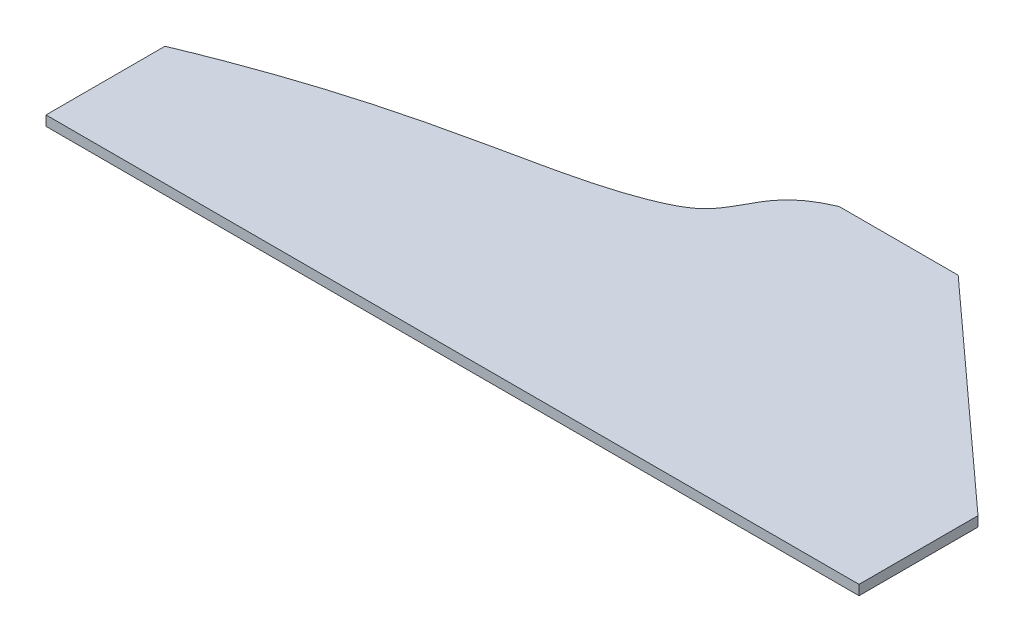
ISO-10303-21;
HEADER;
FILE_DESCRIPTION(('STEP AP214'),'2;1');
FILE_NAME('part.step','',(''),(''),'','','');
FILE_SCHEMA(('AUTOMOTIVE_DESIGN { 1 0 10303 214 1 1 1 1 }'));
ENDSEC;
DATA;
#1=APPLICATION_CONTEXT('core data for automotive mechanical design processes');
#2=APPLICATION_PROTOCOL_DEFINITION('international standard','automotive_design',2000,#1);
#3=PRODUCT_CONTEXT('',#1,'mechanical');
#4=PRODUCT('Part','Part','',(#3));
#5=PRODUCT_RELATED_PRODUCT_CATEGORY('part','',(#4));
#6=PRODUCT_DEFINITION_FORMATION('','',#4);
#7=PRODUCT_DEFINITION_CONTEXT('part definition',#1,'design');
#8=PRODUCT_DEFINITION('design','',#6,#7);
#9=PRODUCT_DEFINITION_SHAPE('','',#8);
#10=(LENGTH_UNIT() NAMED_UNIT(*) SI_UNIT(.MILLI.,.METRE.));
#11=(NAMED_UNIT(*) PLANE_ANGLE_UNIT() SI_UNIT($,.RADIAN.));
#12=(NAMED_UNIT(*) SI_UNIT($,.STERADIAN.) SOLID_ANGLE_UNIT());
#13=UNCERTAINTY_MEASURE_WITH_UNIT(LENGTH_MEASURE(1.E-05),#10,'distance_accuracy_value','');
#14=(GEOMETRIC_REPRESENTATION_CONTEXT(3) GLOBAL_UNCERTAINTY_ASSIGNED_CONTEXT((#13)) GLOBAL_UNIT_ASSIGNED_CONTEXT((#10,
#11,#12)) REPRESENTATION_CONTEXT('',''));
#15=CARTESIAN_POINT('',(0.,0.,0.));
#16=DIRECTION('',(0.,0.,1.));
#17=DIRECTION('',(1.,0.,0.));
#18=AXIS2_PLACEMENT_3D('',#15,#16,#17);
#19=CARTESIAN_POINT('',(107.95,3.175,0.));
#20=DIRECTION('',(-1.,0.,0.));
#21=DIRECTION('',(0.,0.,1.));
#22=AXIS2_PLACEMENT_3D('',#19,#20,#21);
#23=PLANE('',#22);
#24=DIRECTION('',(0.,0.,-1.));
#25=VECTOR('',#24,1.);
#26=CARTESIAN_POINT('',(107.95,0.,0.));
#27=LINE('',#26,#25);
#28=CARTESIAN_POINT('',(107.95,0.,0.));
#29=VERTEX_POINT('',#28);
#30=CARTESIAN_POINT('',(107.95,0.,-38.1));
#31=VERTEX_POINT('',#30);
#32=EDGE_CURVE('E118',#29,#31,#27,.T.);
#33=ORIENTED_EDGE('',*,*,#32,.T.);
#34=DIRECTION('',(0.,-1.,0.));
#35=VECTOR('',#34,1.);
#36=CARTESIAN_POINT('',(107.95,3.175,-38.1));
#37=LINE('',#36,#35);
#38=CARTESIAN_POINT('',(107.95,3.175,-38.1));
#39=VERTEX_POINT('',#38);
#40=EDGE_CURVE('E11',#39,#31,#37,.T.);
#41=ORIENTED_EDGE('',*,*,#40,.F.);
#42=DIRECTION('',(0.,0.,-1.));
#43=VECTOR('',#42,1.);
#44=CARTESIAN_POINT('',(107.95,3.175,0.));
#45=LINE('',#44,#43);
#46=CARTESIAN_POINT('',(107.95,3.175,0.));
#47=VERTEX_POINT('',#46);
#48=EDGE_CURVE('E133',#47,#39,#45,.T.);
#49=ORIENTED_EDGE('',*,*,#48,.F.);
#50=DIRECTION('',(0.,-1.,0.));
#51=VECTOR('',#50,1.);
#52=CARTESIAN_POINT('',(107.95,3.175,0.));
#53=LINE('',#52,#51);
#54=EDGE_CURVE('E111',#47,#29,#53,.T.);
#55=ORIENTED_EDGE('',*,*,#54,.T.);
#56=EDGE_LOOP('',(#33,#41,#49,#55));
#57=FACE_BOUND('',#56,.T.);
#58=ADVANCED_FACE('F31',(#57),#23,.F.);
#59=CARTESIAN_POINT('',(38.1,3.175,-101.6));
#60=DIRECTION('',(-0.672672793996312,0.,0.739940073395944));
#61=DIRECTION('',(0.739940073395944,0.,0.672672793996313));
#62=AXIS2_PLACEMENT_3D('',#59,#60,#61);
#63=PLANE('',#62);
#64=DIRECTION('',(-0.739940073395944,0.,-0.672672793996313));
#65=VECTOR('',#64,1.);
#66=CARTESIAN_POINT('',(38.1,0.,-101.6));
#67=LINE('',#66,#65);
#68=CARTESIAN_POINT('',(38.1,0.,-101.6));
#69=VERTEX_POINT('',#68);
#70=EDGE_CURVE('E121',#31,#69,#67,.T.);
#71=ORIENTED_EDGE('',*,*,#70,.T.);
#72=DIRECTION('',(0.,-1.,0.));
#73=VECTOR('',#72,1.);
#74=CARTESIAN_POINT('',(38.1,3.175,-101.6));
#75=LINE('',#74,#73);
#76=CARTESIAN_POINT('',(38.1,3.175,-101.6));
#77=VERTEX_POINT('',#76);
#78=EDGE_CURVE('E39',#77,#69,#75,.T.);
#79=ORIENTED_EDGE('',*,*,#78,.F.);
#80=DIRECTION('',(-0.739940073395944,0.,-0.672672793996313));
#81=VECTOR('',#80,1.);
#82=CARTESIAN_POINT('',(38.1,3.175,-101.6));
#83=LINE('',#82,#81);
#84=EDGE_CURVE('E84',#39,#77,#83,.T.);
#85=ORIENTED_EDGE('',*,*,#84,.F.);
#86=ORIENTED_EDGE('',*,*,#40,.T.);
#87=EDGE_LOOP('',(#71,#79,#85,#86));
#88=FACE_BOUND('',#87,.T.);
#89=ADVANCED_FACE('F157',(#88),#63,.F.);
#90=CARTESIAN_POINT('',(0.,3.175,-101.6));
#91=DIRECTION('',(0.,0.,1.));
#92=DIRECTION('',(1.,0.,0.));
#93=AXIS2_PLACEMENT_3D('',#90,#91,#92);
#94=PLANE('',#93);
#95=DIRECTION('',(-1.,0.,0.));
#96=VECTOR('',#95,1.);
#97=CARTESIAN_POINT('',(0.,0.,-101.6));
#98=LINE('',#97,#96);
#99=CARTESIAN_POINT('',(5.17066382443395E-13,0.,-101.6));
#100=VERTEX_POINT('',#99);
#101=EDGE_CURVE('E123',#69,#100,#98,.T.);
#102=ORIENTED_EDGE('',*,*,#101,.T.);
#103=DIRECTION('',(0.,-1.,0.));
#104=VECTOR('',#103,1.);
#105=CARTESIAN_POINT('',(5.17066382443395E-13,3.175,-101.6));
#106=LINE('',#105,#104);
#107=CARTESIAN_POINT('',(5.17066382443395E-13,3.175,-101.6));
#108=VERTEX_POINT('',#107);
#109=EDGE_CURVE('E106',#108,#100,#106,.T.);
#110=ORIENTED_EDGE('',*,*,#109,.F.);
#111=DIRECTION('',(-1.,0.,0.));
#112=VECTOR('',#111,1.);
#113=CARTESIAN_POINT('',(0.,3.175,-101.6));
#114=LINE('',#113,#112);
#115=EDGE_CURVE('E97',#77,#108,#114,.T.);
#116=ORIENTED_EDGE('',*,*,#115,.F.);
#117=ORIENTED_EDGE('',*,*,#78,.T.);
#118=EDGE_LOOP('',(#102,#110,#116,#117));
#119=FACE_BOUND('',#118,.T.);
#120=ADVANCED_FACE('F139',(#119),#94,.F.);
#121=CARTESIAN_POINT('',(5.17066382443395E-13,3.175,-101.6));
#122=CARTESIAN_POINT('',(-16.3127224531443,3.175,-94.8030323111909));
#123=CARTESIAN_POINT('',(-13.2352498817142,3.175,-81.3412834366996));
#124=CARTESIAN_POINT('',(-55.6326778331453,3.175,-62.2444744272283));
#125=CARTESIAN_POINT('',(-93.5260085465699,3.175,-62.6308297722625));
#126=CARTESIAN_POINT('',(-152.4,3.175,-38.1));
#127=B_SPLINE_CURVE_WITH_KNOTS('',3,(#121,#122,#123,#124,#125,#126),.UNSPECIFIED.,.F.,.F.,(4,1,
1,4),(0.,0.282581876303435,0.382581876303434,1.),.UNSPECIFIED.);
#128=DIRECTION('',(0.,-1.,0.));
#129=VECTOR('',#128,1.);
#130=SURFACE_OF_LINEAR_EXTRUSION('',#127,#129);
#131=CARTESIAN_POINT('',(5.17066382443395E-13,0.,-101.6));
#132=CARTESIAN_POINT('',(-16.3127224531443,0.,-94.8030323111909));
#133=CARTESIAN_POINT('',(-13.2352498817142,0.,-81.3412834366996));
#134=CARTESIAN_POINT('',(-55.6326778331453,0.,-62.2444744272283));
#135=CARTESIAN_POINT('',(-93.5260085465699,0.,-62.6308297722625));
#136=CARTESIAN_POINT('',(-152.4,0.,-38.1));
#137=B_SPLINE_CURVE_WITH_KNOTS('',3,(#131,#132,#133,#134,#135,#136),.UNSPECIFIED.,.F.,.F.,(4,1,
1,4),(0.,0.282581876303435,0.382581876303434,1.),.UNSPECIFIED.);
#138=CARTESIAN_POINT('',(-152.4,0.,-38.1));
#139=VERTEX_POINT('',#138);
#140=EDGE_CURVE('E105',#100,#139,#137,.T.);
#141=ORIENTED_EDGE('',*,*,#140,.T.);
#142=DIRECTION('',(0.,-1.,0.));
#143=VECTOR('',#142,1.);
#144=CARTESIAN_POINT('',(-152.4,3.175,-38.1));
#145=LINE('',#144,#143);
#146=CARTESIAN_POINT('',(-152.4,3.175,-38.1));
#147=VERTEX_POINT('',#146);
#148=EDGE_CURVE('E102',#147,#139,#145,.T.);
#149=ORIENTED_EDGE('',*,*,#148,.F.);
#150=EDGE_CURVE('E91',#108,#147,#127,.T.);
#151=ORIENTED_EDGE('',*,*,#150,.F.);
#152=ORIENTED_EDGE('',*,*,#109,.T.);
#153=EDGE_LOOP('',(#141,#149,#151,#152));
#154=FACE_BOUND('',#153,.T.);
#155=ADVANCED_FACE('F103',(#154),#130,.F.);
#156=CARTESIAN_POINT('',(-152.4,3.175,0.));
#157=DIRECTION('',(1.,0.,0.));
#158=DIRECTION('',(0.,0.,-1.));
#159=AXIS2_PLACEMENT_3D('',#156,#157,#158);
#160=PLANE('',#159);
#161=DIRECTION('',(0.,0.,1.));
#162=VECTOR('',#161,1.);
#163=CARTESIAN_POINT('',(-152.4,0.,0.));
#164=LINE('',#163,#162);
#165=CARTESIAN_POINT('',(-152.4,0.,0.));
#166=VERTEX_POINT('',#165);
#167=EDGE_CURVE('E70',#139,#166,#164,.T.);
#168=ORIENTED_EDGE('',*,*,#167,.T.);
#169=DIRECTION('',(0.,-1.,0.));
#170=VECTOR('',#169,1.);
#171=CARTESIAN_POINT('',(-152.4,3.175,0.));
#172=LINE('',#171,#170);
#173=CARTESIAN_POINT('',(-152.4,3.175,0.));
#174=VERTEX_POINT('',#173);
#175=EDGE_CURVE('E107',#174,#166,#172,.T.);
#176=ORIENTED_EDGE('',*,*,#175,.F.);
#177=DIRECTION('',(0.,0.,1.));
#178=VECTOR('',#177,1.);
#179=CARTESIAN_POINT('',(-152.4,3.175,0.));
#180=LINE('',#179,#178);
#181=EDGE_CURVE('E95',#147,#174,#180,.T.);
#182=ORIENTED_EDGE('',*,*,#181,.F.);
#183=ORIENTED_EDGE('',*,*,#148,.T.);
#184=EDGE_LOOP('',(#168,#176,#182,#183));
#185=FACE_BOUND('',#184,.T.);
#186=ADVANCED_FACE('F109',(#185),#160,.F.);
#187=CARTESIAN_POINT('',(-152.4,3.175,0.));
#188=DIRECTION('',(0.,0.,-1.));
#189=DIRECTION('',(-1.,0.,0.));
#190=AXIS2_PLACEMENT_3D('',#187,#188,#189);
#191=PLANE('',#190);
#192=DIRECTION('',(1.,0.,0.));
#193=VECTOR('',#192,1.);
#194=CARTESIAN_POINT('',(-152.4,0.,0.));
#195=LINE('',#194,#193);
#196=EDGE_CURVE('E76',#166,#29,#195,.T.);
#197=ORIENTED_EDGE('',*,*,#196,.T.);
#198=ORIENTED_EDGE('',*,*,#54,.F.);
#199=DIRECTION('',(1.,0.,0.));
#200=VECTOR('',#199,1.);
#201=CARTESIAN_POINT('',(-152.4,3.175,0.));
#202=LINE('',#201,#200);
#203=EDGE_CURVE('E47',#174,#47,#202,.T.);
#204=ORIENTED_EDGE('',*,*,#203,.F.);
#205=ORIENTED_EDGE('',*,*,#175,.T.);
#206=EDGE_LOOP('',(#197,#198,#204,#205));
#207=FACE_BOUND('',#206,.T.);
#208=ADVANCED_FACE('F146',(#207),#191,.F.);
#209=CARTESIAN_POINT('',(-50.0305096944651,3.175,-67.5256265403389));
#210=DIRECTION('',(0.,1.,0.));
#211=DIRECTION('',(0.,0.,1.));
#212=AXIS2_PLACEMENT_3D('',#209,#210,#211);
#213=PLANE('',#212);
#214=ORIENTED_EDGE('',*,*,#48,.T.);
#215=ORIENTED_EDGE('',*,*,#84,.T.);
#216=ORIENTED_EDGE('',*,*,#115,.T.);
#217=ORIENTED_EDGE('',*,*,#150,.T.);
#218=ORIENTED_EDGE('',*,*,#181,.T.);
#219=ORIENTED_EDGE('',*,*,#203,.T.);
#220=EDGE_LOOP('',(#214,#215,#216,#217,#218,#219));
#221=FACE_BOUND('',#220,.T.);
#222=ADVANCED_FACE('F93',(#221),#213,.T.);
#223=CARTESIAN_POINT('',(-50.0305096944651,0.,-67.5256265403389));
#224=DIRECTION('',(0.,1.,0.));
#225=DIRECTION('',(0.,0.,1.));
#226=AXIS2_PLACEMENT_3D('',#223,#224,#225);
#227=PLANE('',#226);
#228=ORIENTED_EDGE('',*,*,#32,.F.);
#229=ORIENTED_EDGE('',*,*,#196,.F.);
#230=ORIENTED_EDGE('',*,*,#167,.F.);
#231=ORIENTED_EDGE('',*,*,#140,.F.);
#232=ORIENTED_EDGE('',*,*,#101,.F.);
#233=ORIENTED_EDGE('',*,*,#70,.F.);
#234=EDGE_LOOP('',(#228,#229,#230,#231,#232,#233));
#235=FACE_BOUND('',#234,.T.);
#236=ADVANCED_FACE('F142',(#235),#227,.F.);
#237=CLOSED_SHELL('',(#58,#89,#120,#155,#186,#208,#222,#236));
#238=MANIFOLD_SOLID_BREP('B2',#237);
#239=ADVANCED_BREP_SHAPE_REPRESENTATION('',(#18,#238),#14);
#240=SHAPE_DEFINITION_REPRESENTATION(#9,#239);
ENDSEC;
END-ISO-10303-21;
